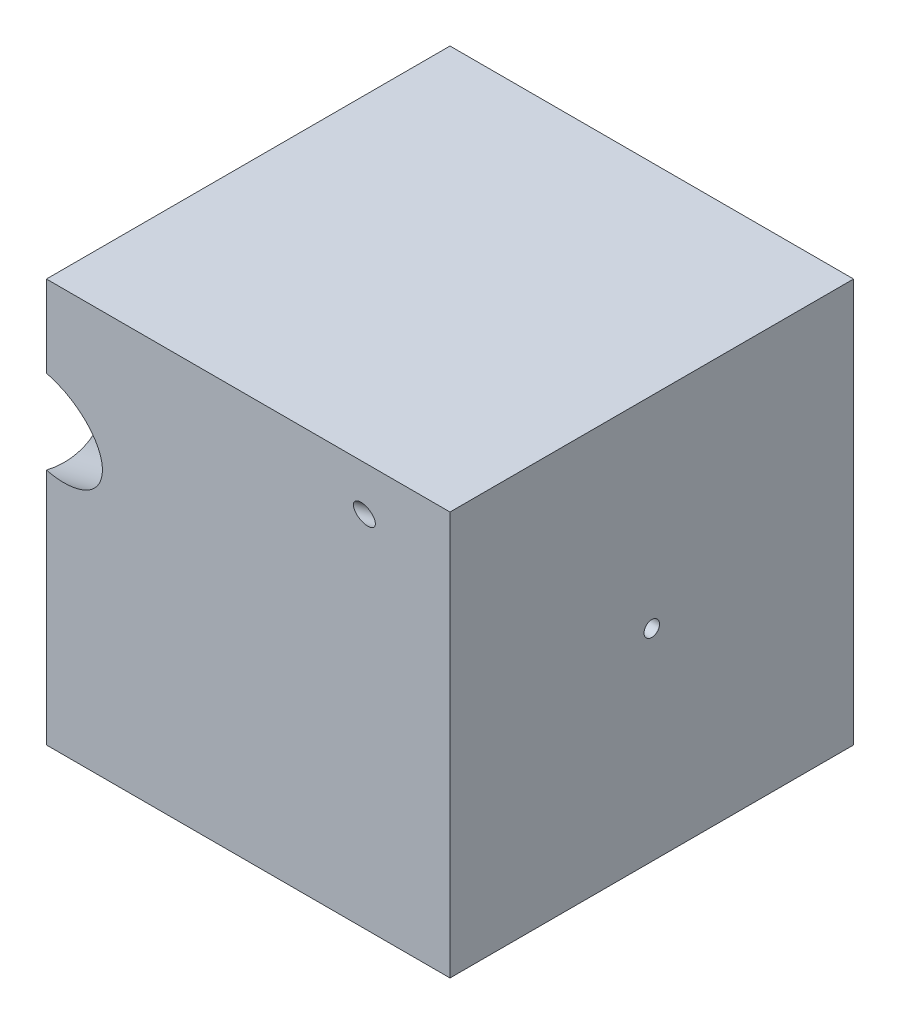
ISO-10303-21;
HEADER;
FILE_DESCRIPTION(('STEP AP214'),'2;1');
FILE_NAME('part.step','',(''),(''),'','','');
FILE_SCHEMA(('AUTOMOTIVE_DESIGN { 1 0 10303 214 1 1 1 1 }'));
ENDSEC;
DATA;
#1=APPLICATION_CONTEXT('core data for automotive mechanical design processes');
#2=APPLICATION_PROTOCOL_DEFINITION('international standard','automotive_design',2000,#1);
#3=PRODUCT_CONTEXT('',#1,'mechanical');
#4=PRODUCT('Part','Part','',(#3));
#5=PRODUCT_RELATED_PRODUCT_CATEGORY('part','',(#4));
#6=PRODUCT_DEFINITION_FORMATION('','',#4);
#7=PRODUCT_DEFINITION_CONTEXT('part definition',#1,'design');
#8=PRODUCT_DEFINITION('design','',#6,#7);
#9=PRODUCT_DEFINITION_SHAPE('','',#8);
#10=(LENGTH_UNIT() NAMED_UNIT(*) SI_UNIT(.MILLI.,.METRE.));
#11=(NAMED_UNIT(*) PLANE_ANGLE_UNIT() SI_UNIT($,.RADIAN.));
#12=(NAMED_UNIT(*) SI_UNIT($,.STERADIAN.) SOLID_ANGLE_UNIT());
#13=UNCERTAINTY_MEASURE_WITH_UNIT(LENGTH_MEASURE(1.E-05),#10,'distance_accuracy_value','');
#14=(GEOMETRIC_REPRESENTATION_CONTEXT(3) GLOBAL_UNCERTAINTY_ASSIGNED_CONTEXT((#13)) GLOBAL_UNIT_ASSIGNED_CONTEXT((#10,
#11,#12)) REPRESENTATION_CONTEXT('',''));
#15=CARTESIAN_POINT('',(0.,0.,0.));
#16=DIRECTION('',(0.,0.,1.));
#17=DIRECTION('',(1.,0.,0.));
#18=AXIS2_PLACEMENT_3D('',#15,#16,#17);
#19=CARTESIAN_POINT('',(26.,-26.,52.));
#20=DIRECTION('',(-1.,0.,0.));
#21=DIRECTION('',(0.,0.,1.));
#22=AXIS2_PLACEMENT_3D('',#19,#20,#21);
#23=PLANE('',#22);
#24=CARTESIAN_POINT('',(26.,0.,26.));
#25=DIRECTION('',(1.,0.,0.));
#26=DIRECTION('',(0.,0.,-1.));
#27=AXIS2_PLACEMENT_3D('',#24,#25,#26);
#28=CIRCLE('',#27,1.);
#29=CARTESIAN_POINT('',(26.,0.,25.));
#30=VERTEX_POINT('',#29);
#31=EDGE_CURVE('E162',#30,#30,#28,.T.);
#32=ORIENTED_EDGE('',*,*,#31,.F.);
#33=EDGE_LOOP('',(#32));
#34=FACE_BOUND('',#33,.T.);
#35=DIRECTION('',(0.,1.,0.));
#36=VECTOR('',#35,1.);
#37=CARTESIAN_POINT('',(26.,-26.,0.));
#38=LINE('',#37,#36);
#39=CARTESIAN_POINT('',(26.,-26.,0.));
#40=VERTEX_POINT('',#39);
#41=CARTESIAN_POINT('',(26.,26.,0.));
#42=VERTEX_POINT('',#41);
#43=EDGE_CURVE('E104',#40,#42,#38,.T.);
#44=ORIENTED_EDGE('',*,*,#43,.T.);
#45=DIRECTION('',(0.,0.,-1.));
#46=VECTOR('',#45,1.);
#47=CARTESIAN_POINT('',(26.,26.,52.));
#48=LINE('',#47,#46);
#49=CARTESIAN_POINT('',(26.,26.,52.));
#50=VERTEX_POINT('',#49);
#51=EDGE_CURVE('E47',#50,#42,#48,.T.);
#52=ORIENTED_EDGE('',*,*,#51,.F.);
#53=DIRECTION('',(0.,1.,0.));
#54=VECTOR('',#53,1.);
#55=CARTESIAN_POINT('',(26.,-26.,52.));
#56=LINE('',#55,#54);
#57=CARTESIAN_POINT('',(26.,-26.,52.));
#58=VERTEX_POINT('',#57);
#59=EDGE_CURVE('E128',#58,#50,#56,.T.);
#60=ORIENTED_EDGE('',*,*,#59,.F.);
#61=DIRECTION('',(0.,0.,-1.));
#62=VECTOR('',#61,1.);
#63=CARTESIAN_POINT('',(26.,-26.,52.));
#64=LINE('',#63,#62);
#65=EDGE_CURVE('E112',#58,#40,#64,.T.);
#66=ORIENTED_EDGE('',*,*,#65,.T.);
#67=EDGE_LOOP('',(#44,#52,#60,#66));
#68=FACE_BOUND('',#67,.T.);
#69=ADVANCED_FACE('F38',(#34,#68),#23,.F.);
#70=CARTESIAN_POINT('',(-26.,26.,52.));
#71=DIRECTION('',(0.,-1.,0.));
#72=DIRECTION('',(0.,0.,-1.));
#73=AXIS2_PLACEMENT_3D('',#70,#71,#72);
#74=PLANE('',#73);
#75=DIRECTION('',(-1.,0.,0.));
#76=VECTOR('',#75,1.);
#77=CARTESIAN_POINT('',(-26.,26.,0.));
#78=LINE('',#77,#76);
#79=CARTESIAN_POINT('',(-26.,26.,0.));
#80=VERTEX_POINT('',#79);
#81=EDGE_CURVE('E120',#42,#80,#78,.T.);
#82=ORIENTED_EDGE('',*,*,#81,.T.);
#83=DIRECTION('',(0.,0.,-1.));
#84=VECTOR('',#83,1.);
#85=CARTESIAN_POINT('',(-26.,26.,52.));
#86=LINE('',#85,#84);
#87=CARTESIAN_POINT('',(-26.,26.,52.));
#88=VERTEX_POINT('',#87);
#89=EDGE_CURVE('E134',#88,#80,#86,.T.);
#90=ORIENTED_EDGE('',*,*,#89,.F.);
#91=DIRECTION('',(-1.,0.,0.));
#92=VECTOR('',#91,1.);
#93=CARTESIAN_POINT('',(-26.,26.,52.));
#94=LINE('',#93,#92);
#95=EDGE_CURVE('E91',#50,#88,#94,.T.);
#96=ORIENTED_EDGE('',*,*,#95,.F.);
#97=ORIENTED_EDGE('',*,*,#51,.T.);
#98=EDGE_LOOP('',(#82,#90,#96,#97));
#99=FACE_BOUND('',#98,.T.);
#100=ADVANCED_FACE('F180',(#99),#74,.F.);
#101=CARTESIAN_POINT('',(-26.,-26.,52.));
#102=DIRECTION('',(1.,0.,0.));
#103=DIRECTION('',(0.,0.,-1.));
#104=AXIS2_PLACEMENT_3D('',#101,#102,#103);
#105=PLANE('',#104);
#106=CARTESIAN_POINT('',(-26.,22.6458980337503,6.0621163334531));
#107=DIRECTION('',(1.,0.,0.));
#108=DIRECTION('',(0.,-1.,0.));
#109=AXIS2_PLACEMENT_3D('',#106,#107,#108);
#110=ELLIPSE('',#109,2.23606797749979,1.);
#111=CARTESIAN_POINT('',(-26.,20.4098300562505,6.0621163334531));
#112=VERTEX_POINT('',#111);
#113=EDGE_CURVE('E143',#112,#112,#110,.T.);
#114=ORIENTED_EDGE('',*,*,#113,.T.);
#115=EDGE_LOOP('',(#114));
#116=FACE_BOUND('',#115,.T.);
#117=CARTESIAN_POINT('',(-26.,-22.,5.25));
#118=DIRECTION('',(-1.,0.,0.));
#119=DIRECTION('',(0.,0.,1.));
#120=AXIS2_PLACEMENT_3D('',#117,#118,#119);
#121=CIRCLE('',#120,1.);
#122=CARTESIAN_POINT('',(-26.,-22.,6.25));
#123=VERTEX_POINT('',#122);
#124=EDGE_CURVE('E146',#123,#123,#121,.T.);
#125=ORIENTED_EDGE('',*,*,#124,.F.);
#126=EDGE_LOOP('',(#125));
#127=FACE_BOUND('',#126,.T.);
#128=DIRECTION('',(0.,-1.,0.));
#129=VECTOR('',#128,1.);
#130=CARTESIAN_POINT('',(-26.,-26.,52.));
#131=LINE('',#130,#129);
#132=CARTESIAN_POINT('',(-26.,4.68073054722557,52.));
#133=VERTEX_POINT('',#132);
#134=CARTESIAN_POINT('',(-26.,-26.,52.));
#135=VERTEX_POINT('',#134);
#136=EDGE_CURVE('E102',#133,#135,#131,.T.);
#137=ORIENTED_EDGE('',*,*,#136,.F.);
#138=CARTESIAN_POINT('',(-26.,10.0900974233027,52.));
#139=DIRECTION('',(1.,0.,0.));
#140=DIRECTION('',(0.,-0.447213595499958,-0.894427190999916));
#141=AXIS2_PLACEMENT_3D('',#138,#139,#140);
#142=ELLIPSE('',#141,7.65,5.1);
#143=CARTESIAN_POINT('',(-26.,15.4994642993798,52.));
#144=VERTEX_POINT('',#143);
#145=EDGE_CURVE('E54',#133,#144,#142,.T.);
#146=ORIENTED_EDGE('',*,*,#145,.T.);
#147=EDGE_CURVE('E100',#88,#144,#131,.T.);
#148=ORIENTED_EDGE('',*,*,#147,.F.);
#149=ORIENTED_EDGE('',*,*,#89,.T.);
#150=DIRECTION('',(0.,-1.,0.));
#151=VECTOR('',#150,1.);
#152=CARTESIAN_POINT('',(-26.,-26.,0.));
#153=LINE('',#152,#151);
#154=CARTESIAN_POINT('',(-26.,-26.,0.));
#155=VERTEX_POINT('',#154);
#156=EDGE_CURVE('E123',#80,#155,#153,.T.);
#157=ORIENTED_EDGE('',*,*,#156,.T.);
#158=DIRECTION('',(0.,0.,-1.));
#159=VECTOR('',#158,1.);
#160=CARTESIAN_POINT('',(-26.,-26.,52.));
#161=LINE('',#160,#159);
#162=EDGE_CURVE('E131',#135,#155,#161,.T.);
#163=ORIENTED_EDGE('',*,*,#162,.F.);
#164=EDGE_LOOP('',(#137,#146,#148,#149,#157,#163));
#165=FACE_BOUND('',#164,.T.);
#166=ADVANCED_FACE('F98',(#116,#127,#165),#105,.F.);
#167=CARTESIAN_POINT('',(-26.,-26.,52.));
#168=DIRECTION('',(0.,1.,0.));
#169=DIRECTION('',(0.,0.,1.));
#170=AXIS2_PLACEMENT_3D('',#167,#168,#169);
#171=PLANE('',#170);
#172=CARTESIAN_POINT('',(4.8465577496096,-26.,45.3250521609312));
#173=DIRECTION('',(0.,1.,0.));
#174=DIRECTION('',(-0.707106781186548,0.,0.707106781186547));
#175=AXIS2_PLACEMENT_3D('',#172,#173,#174);
#176=ELLIPSE('',#175,1.22474487139159,1.);
#177=CARTESIAN_POINT('',(3.98053234582516,-26.,46.1910775647157));
#178=VERTEX_POINT('',#177);
#179=EDGE_CURVE('E41',#178,#178,#176,.F.);
#180=ORIENTED_EDGE('',*,*,#179,.F.);
#181=EDGE_LOOP('',(#180));
#182=FACE_BOUND('',#181,.T.);
#183=DIRECTION('',(1.,0.,0.));
#184=VECTOR('',#183,1.);
#185=CARTESIAN_POINT('',(-26.,-26.,0.));
#186=LINE('',#185,#184);
#187=EDGE_CURVE('E83',#155,#40,#186,.T.);
#188=ORIENTED_EDGE('',*,*,#187,.T.);
#189=ORIENTED_EDGE('',*,*,#65,.F.);
#190=DIRECTION('',(1.,0.,0.));
#191=VECTOR('',#190,1.);
#192=CARTESIAN_POINT('',(-26.,-26.,52.));
#193=LINE('',#192,#191);
#194=EDGE_CURVE('E62',#135,#58,#193,.T.);
#195=ORIENTED_EDGE('',*,*,#194,.F.);
#196=ORIENTED_EDGE('',*,*,#162,.T.);
#197=EDGE_LOOP('',(#188,#189,#195,#196));
#198=FACE_BOUND('',#197,.T.);
#199=ADVANCED_FACE('F194',(#182,#198),#171,.F.);
#200=CARTESIAN_POINT('',(0.,0.,52.));
#201=DIRECTION('',(0.,0.,-1.));
#202=DIRECTION('',(-1.,0.,0.));
#203=AXIS2_PLACEMENT_3D('',#200,#201,#202);
#204=PLANE('',#203);
#205=CARTESIAN_POINT('',(14.9651543231738,20.2336239046515,52.));
#206=DIRECTION('',(0.,0.,-1.));
#207=DIRECTION('',(-0.894427190999916,0.447213595499958,0.));
#208=AXIS2_PLACEMENT_3D('',#205,#206,#207);
#209=ELLIPSE('',#208,1.5,1.);
#210=CARTESIAN_POINT('',(13.6235135366739,20.9044442979014,52.));
#211=VERTEX_POINT('',#210);
#212=EDGE_CURVE('E139',#211,#211,#209,.F.);
#213=ORIENTED_EDGE('',*,*,#212,.F.);
#214=EDGE_LOOP('',(#213));
#215=FACE_BOUND('',#214,.T.);
#216=ORIENTED_EDGE('',*,*,#147,.T.);
#217=CARTESIAN_POINT('',(-26.,10.0900974233027,52.));
#218=DIRECTION('',(0.,0.,-1.));
#219=DIRECTION('',(0.894427190999916,-0.447213595499958,0.));
#220=AXIS2_PLACEMENT_3D('',#217,#218,#219);
#221=ELLIPSE('',#220,7.65,5.1);
#222=EDGE_CURVE('E11',#144,#133,#221,.T.);
#223=ORIENTED_EDGE('',*,*,#222,.T.);
#224=ORIENTED_EDGE('',*,*,#136,.T.);
#225=ORIENTED_EDGE('',*,*,#194,.T.);
#226=ORIENTED_EDGE('',*,*,#59,.T.);
#227=ORIENTED_EDGE('',*,*,#95,.T.);
#228=EDGE_LOOP('',(#216,#223,#224,#225,#226,#227));
#229=FACE_BOUND('',#228,.T.);
#230=ADVANCED_FACE('F107',(#215,#229),#204,.F.);
#231=CARTESIAN_POINT('',(0.,0.,0.));
#232=DIRECTION('',(0.,0.,-1.));
#233=DIRECTION('',(-1.,0.,0.));
#234=AXIS2_PLACEMENT_3D('',#231,#232,#233);
#235=PLANE('',#234);
#236=CARTESIAN_POINT('',(0.,0.,0.));
#237=DIRECTION('',(0.,0.,-1.));
#238=DIRECTION('',(-1.,0.,0.));
#239=AXIS2_PLACEMENT_3D('',#236,#237,#238);
#240=CIRCLE('',#239,1.);
#241=CARTESIAN_POINT('',(-1.,0.,0.));
#242=VERTEX_POINT('',#241);
#243=EDGE_CURVE('E211',#242,#242,#240,.T.);
#244=ORIENTED_EDGE('',*,*,#243,.F.);
#245=EDGE_LOOP('',(#244));
#246=FACE_BOUND('',#245,.T.);
#247=ORIENTED_EDGE('',*,*,#43,.F.);
#248=ORIENTED_EDGE('',*,*,#187,.F.);
#249=ORIENTED_EDGE('',*,*,#156,.F.);
#250=ORIENTED_EDGE('',*,*,#81,.F.);
#251=EDGE_LOOP('',(#247,#248,#249,#250));
#252=FACE_BOUND('',#251,.T.);
#253=ADVANCED_FACE('F183',(#246,#252),#235,.T.);
#254=CARTESIAN_POINT('',(-29.5355339059327,11.857864376269,55.5355339059327));
#255=DIRECTION('',(0.666666666666667,-0.333333333333333,-0.666666666666667));
#256=DIRECTION('',(-0.707106781186548,0.,-0.707106781186548));
#257=AXIS2_PLACEMENT_3D('',#254,#255,#256);
#258=CYLINDRICAL_SURFACE('',#257,5.1);
#259=CARTESIAN_POINT('',(-7.97997835037718,1.08008659849128,33.9799783503772));
#260=DIRECTION('',(0.666666666666667,-0.333333333333333,-0.666666666666667));
#261=DIRECTION('',(-0.707106781186548,0.,-0.707106781186548));
#262=AXIS2_PLACEMENT_3D('',#259,#260,#261);
#263=CIRCLE('',#262,5.1);
#264=CARTESIAN_POINT('',(-11.5862229344286,1.08008659849128,30.3737337663258));
#265=VERTEX_POINT('',#264);
#266=EDGE_CURVE('E105',#265,#265,#263,.T.);
#267=ORIENTED_EDGE('',*,*,#266,.T.);
#268=EDGE_LOOP('',(#267));
#269=FACE_BOUND('',#268,.T.);
#270=ORIENTED_EDGE('',*,*,#222,.F.);
#271=ORIENTED_EDGE('',*,*,#145,.F.);
#272=EDGE_LOOP('',(#270,#271));
#273=FACE_BOUND('',#272,.T.);
#274=ADVANCED_FACE('F93',(#269,#273),#258,.F.);
#275=CARTESIAN_POINT('',(-7.97997835037718,1.08008659849128,33.9799783503772));
#276=DIRECTION('',(0.666666666666667,-0.333333333333333,-0.666666666666667));
#277=DIRECTION('',(-0.707106781186548,0.,-0.707106781186548));
#278=AXIS2_PLACEMENT_3D('',#275,#276,#277);
#279=PLANE('',#278);
#280=ORIENTED_EDGE('',*,*,#266,.F.);
#281=EDGE_LOOP('',(#280));
#282=FACE_BOUND('',#281,.T.);
#283=ADVANCED_FACE('F191',(#282),#279,.F.);
#284=CARTESIAN_POINT('',(23.032557713908,16.1999222092844,43.9325966092658));
#285=DIRECTION('',(-0.666666666666667,0.333333333333333,0.666666666666667));
#286=DIRECTION('',(0.707106781186547,0.,0.707106781186547));
#287=AXIS2_PLACEMENT_3D('',#284,#285,#286);
#288=CYLINDRICAL_SURFACE('',#287,1.);
#289=CARTESIAN_POINT('',(23.032557713908,16.1999222092844,43.9325966092658));
#290=DIRECTION('',(0.666666666666667,-0.333333333333333,-0.666666666666667));
#291=DIRECTION('',(-0.707106781186548,0.,-0.707106781186548));
#292=AXIS2_PLACEMENT_3D('',#289,#290,#291);
#293=CIRCLE('',#292,1.);
#294=CARTESIAN_POINT('',(22.3254509327214,16.1999222092844,43.2254898280792));
#295=VERTEX_POINT('',#294);
#296=EDGE_CURVE('E142',#295,#295,#293,.T.);
#297=ORIENTED_EDGE('',*,*,#296,.T.);
#298=EDGE_LOOP('',(#297));
#299=FACE_BOUND('',#298,.T.);
#300=ORIENTED_EDGE('',*,*,#212,.T.);
#301=EDGE_LOOP('',(#300));
#302=FACE_BOUND('',#301,.T.);
#303=ADVANCED_FACE('F253',(#299,#302),#288,.F.);
#304=CARTESIAN_POINT('',(23.032557713908,16.1999222092844,43.9325966092658));
#305=DIRECTION('',(0.666666666666667,-0.333333333333333,-0.666666666666667));
#306=DIRECTION('',(-0.707106781186548,0.,-0.707106781186548));
#307=AXIS2_PLACEMENT_3D('',#304,#305,#306);
#308=PLANE('',#307);
#309=ORIENTED_EDGE('',*,*,#296,.F.);
#310=EDGE_LOOP('',(#309));
#311=FACE_BOUND('',#310,.T.);
#312=ADVANCED_FACE('F243',(#311),#308,.F.);
#313=CARTESIAN_POINT('',(-14.,-22.,5.25));
#314=DIRECTION('',(-1.,0.,0.));
#315=DIRECTION('',(0.,0.,1.));
#316=AXIS2_PLACEMENT_3D('',#313,#314,#315);
#317=CYLINDRICAL_SURFACE('',#316,1.);
#318=CARTESIAN_POINT('',(-14.,-22.,5.25));
#319=DIRECTION('',(-1.,0.,0.));
#320=DIRECTION('',(0.,0.,1.));
#321=AXIS2_PLACEMENT_3D('',#318,#319,#320);
#322=CIRCLE('',#321,1.);
#323=CARTESIAN_POINT('',(-14.,-22.,6.25));
#324=VERTEX_POINT('',#323);
#325=EDGE_CURVE('E153',#324,#324,#322,.T.);
#326=ORIENTED_EDGE('',*,*,#325,.F.);
#327=EDGE_LOOP('',(#326));
#328=FACE_BOUND('',#327,.T.);
#329=ORIENTED_EDGE('',*,*,#124,.T.);
#330=EDGE_LOOP('',(#329));
#331=FACE_BOUND('',#330,.T.);
#332=ADVANCED_FACE('F240',(#328,#331),#317,.F.);
#333=CARTESIAN_POINT('',(-14.,-22.,5.25));
#334=DIRECTION('',(-1.,0.,0.));
#335=DIRECTION('',(0.,0.,1.));
#336=AXIS2_PLACEMENT_3D('',#333,#334,#335);
#337=PLANE('',#336);
#338=ORIENTED_EDGE('',*,*,#325,.T.);
#339=EDGE_LOOP('',(#338));
#340=FACE_BOUND('',#339,.T.);
#341=ADVANCED_FACE('F242',(#340),#337,.T.);
#342=CARTESIAN_POINT('',(-27.1134661794979,24.8728303927462,6.0621163334531));
#343=DIRECTION('',(0.447213595499958,-0.894427190999916,0.));
#344=DIRECTION('',(0.894427190999916,0.447213595499958,0.));
#345=AXIS2_PLACEMENT_3D('',#342,#343,#344);
#346=CYLINDRICAL_SURFACE('',#345,1.);
#347=CARTESIAN_POINT('',(-21.7469030334984,14.1397041007472,6.0621163334531));
#348=DIRECTION('',(0.447213595499958,-0.894427190999916,0.));
#349=DIRECTION('',(0.894427190999916,0.447213595499958,0.));
#350=AXIS2_PLACEMENT_3D('',#347,#348,#349);
#351=CIRCLE('',#350,1.);
#352=CARTESIAN_POINT('',(-20.8524758424985,14.5869176962472,6.0621163334531));
#353=VERTEX_POINT('',#352);
#354=EDGE_CURVE('E147',#353,#353,#351,.T.);
#355=ORIENTED_EDGE('',*,*,#354,.T.);
#356=EDGE_LOOP('',(#355));
#357=FACE_BOUND('',#356,.T.);
#358=ORIENTED_EDGE('',*,*,#113,.F.);
#359=EDGE_LOOP('',(#358));
#360=FACE_BOUND('',#359,.T.);
#361=ADVANCED_FACE('F250',(#357,#360),#346,.F.);
#362=CARTESIAN_POINT('',(-21.7469030334984,14.1397041007472,6.0621163334531));
#363=DIRECTION('',(0.447213595499958,-0.894427190999916,0.));
#364=DIRECTION('',(0.894427190999916,0.447213595499958,0.));
#365=AXIS2_PLACEMENT_3D('',#362,#363,#364);
#366=PLANE('',#365);
#367=ORIENTED_EDGE('',*,*,#354,.F.);
#368=EDGE_LOOP('',(#367));
#369=FACE_BOUND('',#368,.T.);
#370=ADVANCED_FACE('F303',(#369),#366,.F.);
#371=CARTESIAN_POINT('',(14.,0.,26.));
#372=DIRECTION('',(1.,0.,0.));
#373=DIRECTION('',(0.,0.,-1.));
#374=AXIS2_PLACEMENT_3D('',#371,#372,#373);
#375=CYLINDRICAL_SURFACE('',#374,1.);
#376=CARTESIAN_POINT('',(14.,0.,26.));
#377=DIRECTION('',(1.,0.,0.));
#378=DIRECTION('',(0.,0.,-1.));
#379=AXIS2_PLACEMENT_3D('',#376,#377,#378);
#380=CIRCLE('',#379,1.);
#381=CARTESIAN_POINT('',(14.,0.,25.));
#382=VERTEX_POINT('',#381);
#383=EDGE_CURVE('E156',#382,#382,#380,.T.);
#384=ORIENTED_EDGE('',*,*,#383,.F.);
#385=EDGE_LOOP('',(#384));
#386=FACE_BOUND('',#385,.T.);
#387=ORIENTED_EDGE('',*,*,#31,.T.);
#388=EDGE_LOOP('',(#387));
#389=FACE_BOUND('',#388,.T.);
#390=ADVANCED_FACE('F310',(#386,#389),#375,.F.);
#391=CARTESIAN_POINT('',(14.,0.,26.));
#392=DIRECTION('',(1.,0.,0.));
#393=DIRECTION('',(0.,0.,-1.));
#394=AXIS2_PLACEMENT_3D('',#391,#392,#393);
#395=PLANE('',#394);
#396=ORIENTED_EDGE('',*,*,#383,.T.);
#397=EDGE_LOOP('',(#396));
#398=FACE_BOUND('',#397,.T.);
#399=ADVANCED_FACE('F325',(#398),#395,.T.);
#400=CARTESIAN_POINT('',(0.,0.,12.));
#401=DIRECTION('',(0.,0.,-1.));
#402=DIRECTION('',(-1.,0.,0.));
#403=AXIS2_PLACEMENT_3D('',#400,#401,#402);
#404=CYLINDRICAL_SURFACE('',#403,1.);
#405=CARTESIAN_POINT('',(0.,0.,12.));
#406=DIRECTION('',(0.,0.,-1.));
#407=DIRECTION('',(-1.,0.,0.));
#408=AXIS2_PLACEMENT_3D('',#405,#406,#407);
#409=CIRCLE('',#408,1.);
#410=CARTESIAN_POINT('',(-1.,0.,12.));
#411=VERTEX_POINT('',#410);
#412=EDGE_CURVE('E208',#411,#411,#409,.T.);
#413=ORIENTED_EDGE('',*,*,#412,.F.);
#414=EDGE_LOOP('',(#413));
#415=FACE_BOUND('',#414,.T.);
#416=ORIENTED_EDGE('',*,*,#243,.T.);
#417=EDGE_LOOP('',(#416));
#418=FACE_BOUND('',#417,.T.);
#419=ADVANCED_FACE('F334',(#415,#418),#404,.F.);
#420=CARTESIAN_POINT('',(0.,0.,12.));
#421=DIRECTION('',(0.,0.,-1.));
#422=DIRECTION('',(-1.,0.,0.));
#423=AXIS2_PLACEMENT_3D('',#420,#421,#422);
#424=PLANE('',#423);
#425=ORIENTED_EDGE('',*,*,#412,.T.);
#426=EDGE_LOOP('',(#425));
#427=FACE_BOUND('',#426,.T.);
#428=ADVANCED_FACE('F351',(#427),#424,.T.);
#429=CARTESIAN_POINT('',(9.80258246120526,-16.0879505768087,40.3690274493356));
#430=DIRECTION('',(-0.408248290463863,-0.816496580927726,0.408248290463863));
#431=DIRECTION('',(0.894427190999916,-0.447213595499958,0.));
#432=AXIS2_PLACEMENT_3D('',#429,#430,#431);
#433=CYLINDRICAL_SURFACE('',#432,1.);
#434=CARTESIAN_POINT('',(9.80258246120526,-16.0879505768087,40.3690274493356));
#435=DIRECTION('',(0.408248290463863,0.816496580927726,-0.408248290463863));
#436=DIRECTION('',(-0.894427190999916,0.447213595499958,0.));
#437=AXIS2_PLACEMENT_3D('',#434,#435,#436);
#438=CIRCLE('',#437,1.);
#439=CARTESIAN_POINT('',(8.90815527020534,-15.6407369813087,40.3690274493356));
#440=VERTEX_POINT('',#439);
#441=EDGE_CURVE('E219',#440,#440,#438,.T.);
#442=ORIENTED_EDGE('',*,*,#441,.T.);
#443=EDGE_LOOP('',(#442));
#444=FACE_BOUND('',#443,.T.);
#445=ORIENTED_EDGE('',*,*,#179,.T.);
#446=EDGE_LOOP('',(#445));
#447=FACE_BOUND('',#446,.T.);
#448=ADVANCED_FACE('F228',(#444,#447),#433,.F.);
#449=CARTESIAN_POINT('',(9.80258246120526,-16.0879505768087,40.3690274493356));
#450=DIRECTION('',(0.408248290463863,0.816496580927726,-0.408248290463863));
#451=DIRECTION('',(-0.894427190999916,0.447213595499958,0.));
#452=AXIS2_PLACEMENT_3D('',#449,#450,#451);
#453=PLANE('',#452);
#454=ORIENTED_EDGE('',*,*,#441,.F.);
#455=EDGE_LOOP('',(#454));
#456=FACE_BOUND('',#455,.T.);
#457=ADVANCED_FACE('F372',(#456),#453,.F.);
#458=CLOSED_SHELL('',(#69,#100,#166,#199,#230,#253,#274,#283,#303,#312,#332,#341,#361,#370,#390,
#399,#419,#428,#448,#457));
#459=MANIFOLD_SOLID_BREP('B2',#458);
#460=ADVANCED_BREP_SHAPE_REPRESENTATION('',(#18,#459),#14);
#461=SHAPE_DEFINITION_REPRESENTATION(#9,#460);
ENDSEC;
END-ISO-10303-21;
